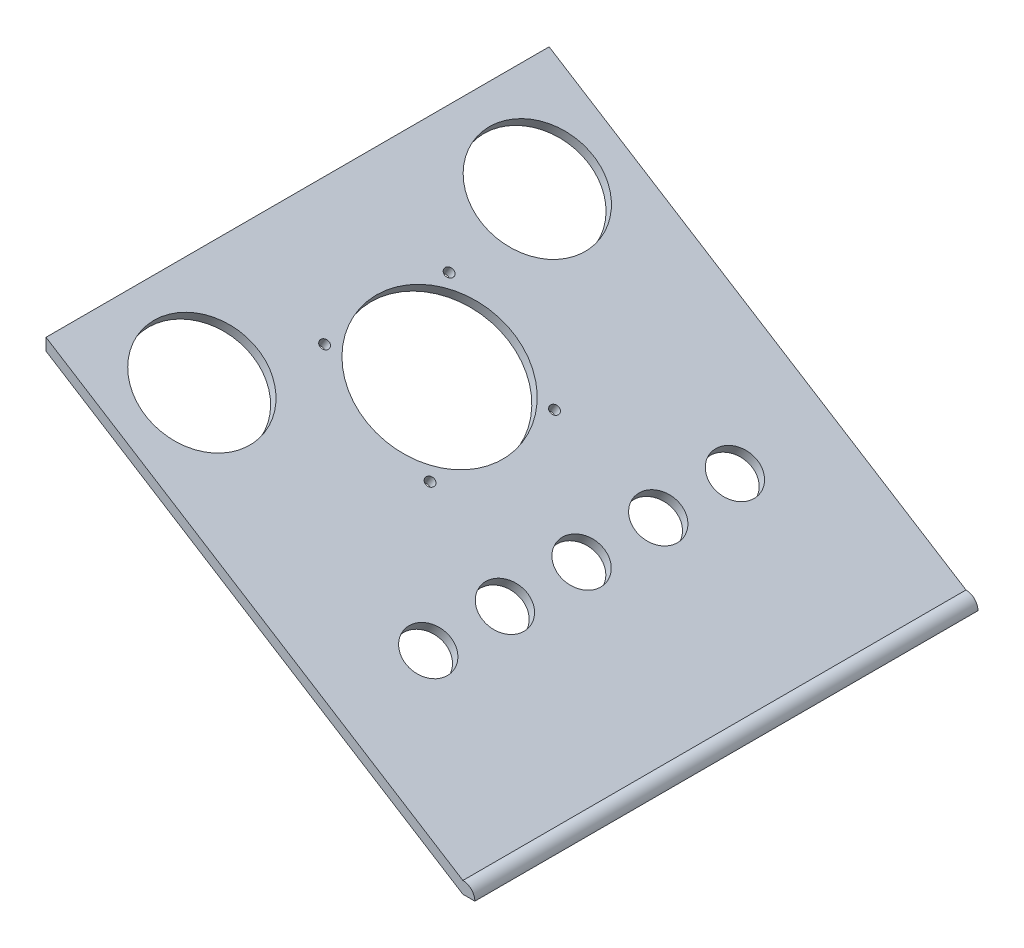
ISO-10303-21;
HEADER;
FILE_DESCRIPTION(('STEP AP214'),'2;1');
FILE_NAME('part.step','',(''),(''),'','','');
FILE_SCHEMA(('AUTOMOTIVE_DESIGN { 1 0 10303 214 1 1 1 1 }'));
ENDSEC;
DATA;
#1=APPLICATION_CONTEXT('core data for automotive mechanical design processes');
#2=APPLICATION_PROTOCOL_DEFINITION('international standard','automotive_design',2000,#1);
#3=PRODUCT_CONTEXT('',#1,'mechanical');
#4=PRODUCT('Part','Part','',(#3));
#5=PRODUCT_RELATED_PRODUCT_CATEGORY('part','',(#4));
#6=PRODUCT_DEFINITION_FORMATION('','',#4);
#7=PRODUCT_DEFINITION_CONTEXT('part definition',#1,'design');
#8=PRODUCT_DEFINITION('design','',#6,#7);
#9=PRODUCT_DEFINITION_SHAPE('','',#8);
#10=(LENGTH_UNIT() NAMED_UNIT(*) SI_UNIT(.MILLI.,.METRE.));
#11=(NAMED_UNIT(*) PLANE_ANGLE_UNIT() SI_UNIT($,.RADIAN.));
#12=(NAMED_UNIT(*) SI_UNIT($,.STERADIAN.) SOLID_ANGLE_UNIT());
#13=UNCERTAINTY_MEASURE_WITH_UNIT(LENGTH_MEASURE(1.E-05),#10,'distance_accuracy_value','');
#14=(GEOMETRIC_REPRESENTATION_CONTEXT(3) GLOBAL_UNCERTAINTY_ASSIGNED_CONTEXT((#13)) GLOBAL_UNIT_ASSIGNED_CONTEXT((#10,
#11,#12)) REPRESENTATION_CONTEXT('',''));
#15=CARTESIAN_POINT('',(0.,0.,0.));
#16=DIRECTION('',(0.,0.,1.));
#17=DIRECTION('',(1.,0.,0.));
#18=AXIS2_PLACEMENT_3D('',#15,#16,#17);
#19=CARTESIAN_POINT('',(0.,3.175,133.35));
#20=DIRECTION('',(0.532029503535746,0.846725815933061,0.));
#21=DIRECTION('',(-0.846725815933061,0.532029503535746,0.));
#22=AXIS2_PLACEMENT_3D('',#19,#20,#21);
#23=PLANE('',#22);
#24=CARTESIAN_POINT('',(75.2739250364491,-44.1224228643278,26.035));
#25=DIRECTION('',(0.532029503535746,0.846725815933061,0.));
#26=DIRECTION('',(-0.846725815933061,0.532029503535746,0.));
#27=AXIS2_PLACEMENT_3D('',#24,#25,#26);
#28=CIRCLE('',#27,6.00000000000001);
#29=CARTESIAN_POINT('',(70.1935701408507,-40.9302458431134,26.035));
#30=VERTEX_POINT('',#29);
#31=EDGE_CURVE('E260',#30,#30,#28,.T.);
#32=ORIENTED_EDGE('',*,*,#31,.F.);
#33=EDGE_LOOP('',(#32));
#34=FACE_BOUND('',#33,.T.);
#35=CARTESIAN_POINT('',(75.2739250364491,-44.1224228643278,86.995));
#36=DIRECTION('',(0.532029503535746,0.846725815933061,0.));
#37=DIRECTION('',(-0.846725815933061,0.532029503535746,0.));
#38=AXIS2_PLACEMENT_3D('',#35,#36,#37);
#39=CIRCLE('',#38,6.00000000000001);
#40=CARTESIAN_POINT('',(70.1935701408507,-40.9302458431134,86.995));
#41=VERTEX_POINT('',#40);
#42=EDGE_CURVE('E261',#41,#41,#39,.T.);
#43=ORIENTED_EDGE('',*,*,#42,.F.);
#44=EDGE_LOOP('',(#43));
#45=FACE_BOUND('',#44,.T.);
#46=CARTESIAN_POINT('',(75.2739250364491,-44.1224228643279,107.315));
#47=DIRECTION('',(0.532029503535746,0.846725815933061,0.));
#48=DIRECTION('',(-0.846725815933061,0.532029503535746,0.));
#49=AXIS2_PLACEMENT_3D('',#46,#47,#48);
#50=CIRCLE('',#49,5.99999999999999);
#51=CARTESIAN_POINT('',(70.1935701408507,-40.9302458431134,107.315));
#52=VERTEX_POINT('',#51);
#53=EDGE_CURVE('E265',#52,#52,#50,.T.);
#54=ORIENTED_EDGE('',*,*,#53,.F.);
#55=EDGE_LOOP('',(#54));
#56=FACE_BOUND('',#55,.T.);
#57=CARTESIAN_POINT('',(75.2739250364491,-44.1224228643278,66.675));
#58=DIRECTION('',(0.532029503535746,0.846725815933061,0.));
#59=DIRECTION('',(-0.846725815933061,0.532029503535746,0.));
#60=AXIS2_PLACEMENT_3D('',#57,#58,#59);
#61=CIRCLE('',#60,5.99998799999999);
#62=CARTESIAN_POINT('',(70.1935803015605,-40.9302522274674,66.675));
#63=VERTEX_POINT('',#62);
#64=EDGE_CURVE('E269',#63,#63,#61,.T.);
#65=ORIENTED_EDGE('',*,*,#64,.F.);
#66=EDGE_LOOP('',(#65));
#67=FACE_BOUND('',#66,.T.);
#68=CARTESIAN_POINT('',(75.2739250364491,-44.1224228643278,46.355));
#69=DIRECTION('',(0.532029503535746,0.846725815933061,0.));
#70=DIRECTION('',(-0.846725815933061,0.532029503535746,0.));
#71=AXIS2_PLACEMENT_3D('',#68,#69,#70);
#72=CIRCLE('',#71,6.00000000000001);
#73=CARTESIAN_POINT('',(70.1935701408507,-40.9302458431134,46.355));
#74=VERTEX_POINT('',#73);
#75=EDGE_CURVE('E231',#74,#74,#72,.T.);
#76=ORIENTED_EDGE('',*,*,#75,.F.);
#77=EDGE_LOOP('',(#76));
#78=FACE_BOUND('',#77,.T.);
#79=CARTESIAN_POINT('',(19.0859481700261,-8.81741518131621,111.125));
#80=DIRECTION('',(0.532029503535746,0.846725815933061,0.));
#81=DIRECTION('',(-0.846725815933061,0.532029503535746,0.));
#82=AXIS2_PLACEMENT_3D('',#79,#80,#81);
#83=CIRCLE('',#82,15.);
#84=CARTESIAN_POINT('',(6.38506093103023,-0.836972628280022,111.125));
#85=VERTEX_POINT('',#84);
#86=EDGE_CURVE('E222',#85,#85,#83,.T.);
#87=ORIENTED_EDGE('',*,*,#86,.F.);
#88=EDGE_LOOP('',(#87));
#89=FACE_BOUND('',#88,.T.);
#90=CARTESIAN_POINT('',(19.0859481700261,-8.8174151813162,22.225));
#91=DIRECTION('',(0.532029503535746,0.846725815933061,0.));
#92=DIRECTION('',(-0.846725815933061,0.532029503535746,0.));
#93=AXIS2_PLACEMENT_3D('',#90,#91,#92);
#94=CIRCLE('',#93,15.);
#95=CARTESIAN_POINT('',(6.38506093103024,-0.83697262828002,22.225));
#96=VERTEX_POINT('',#95);
#97=EDGE_CURVE('E245',#96,#96,#94,.T.);
#98=ORIENTED_EDGE('',*,*,#97,.F.);
#99=EDGE_LOOP('',(#98));
#100=FACE_BOUND('',#99,.T.);
#101=CARTESIAN_POINT('',(51.60793848112,-29.2521982405037,50.175));
#102=DIRECTION('',(0.532029503535746,0.846725815933061,0.));
#103=DIRECTION('',(-0.846725815933061,0.532029503535746,0.));
#104=AXIS2_PLACEMENT_3D('',#101,#102,#103);
#105=CIRCLE('',#104,1.2);
#106=CARTESIAN_POINT('',(50.5918675020004,-28.6137628362608,50.175));
#107=VERTEX_POINT('',#106);
#108=EDGE_CURVE('E160',#107,#107,#105,.T.);
#109=ORIENTED_EDGE('',*,*,#108,.F.);
#110=EDGE_LOOP('',(#109));
#111=FACE_BOUND('',#110,.T.);
#112=CARTESIAN_POINT('',(51.60793848112,-29.2521982405037,83.175));
#113=DIRECTION('',(0.532029503535746,0.846725815933061,0.));
#114=DIRECTION('',(-0.846725815933061,0.532029503535746,0.));
#115=AXIS2_PLACEMENT_3D('',#112,#113,#114);
#116=CIRCLE('',#115,1.2);
#117=CARTESIAN_POINT('',(50.5918675020004,-28.6137628362608,83.175));
#118=VERTEX_POINT('',#117);
#119=EDGE_CURVE('E159',#118,#118,#116,.T.);
#120=ORIENTED_EDGE('',*,*,#119,.F.);
#121=EDGE_LOOP('',(#120));
#122=FACE_BOUND('',#121,.T.);
#123=CARTESIAN_POINT('',(37.6369625182245,-20.4737114321639,66.675));
#124=DIRECTION('',(0.532029503535746,0.846725815933061,0.));
#125=DIRECTION('',(-0.846725815933061,0.532029503535746,0.));
#126=AXIS2_PLACEMENT_3D('',#123,#124,#125);
#127=CIRCLE('',#126,19.75);
#128=CARTESIAN_POINT('',(20.9141276535466,-9.96612873733292,66.675));
#129=VERTEX_POINT('',#128);
#130=EDGE_CURVE('E147',#129,#129,#127,.T.);
#131=ORIENTED_EDGE('',*,*,#130,.F.);
#132=EDGE_LOOP('',(#131));
#133=FACE_BOUND('',#132,.T.);
#134=CARTESIAN_POINT('',(23.665986555329,-11.6952246238241,83.175));
#135=DIRECTION('',(0.532029503535746,0.846725815933061,0.));
#136=DIRECTION('',(-0.846725815933061,0.532029503535746,0.));
#137=AXIS2_PLACEMENT_3D('',#134,#135,#136);
#138=CIRCLE('',#137,1.20000000000003);
#139=CARTESIAN_POINT('',(22.6499155762094,-11.0567892195812,83.175));
#140=VERTEX_POINT('',#139);
#141=EDGE_CURVE('E152',#140,#140,#138,.T.);
#142=ORIENTED_EDGE('',*,*,#141,.F.);
#143=EDGE_LOOP('',(#142));
#144=FACE_BOUND('',#143,.T.);
#145=CARTESIAN_POINT('',(23.665986555329,-11.6952246238241,50.175));
#146=DIRECTION('',(0.532029503535746,0.846725815933061,0.));
#147=DIRECTION('',(-0.846725815933061,0.532029503535746,0.));
#148=AXIS2_PLACEMENT_3D('',#145,#146,#147);
#149=CIRCLE('',#148,1.2);
#150=CARTESIAN_POINT('',(22.6499155762094,-11.0567892195812,50.175));
#151=VERTEX_POINT('',#150);
#152=EDGE_CURVE('E164',#151,#151,#149,.T.);
#153=ORIENTED_EDGE('',*,*,#152,.F.);
#154=EDGE_LOOP('',(#153));
#155=FACE_BOUND('',#154,.T.);
#156=DIRECTION('',(0.846725815933061,-0.532029503535746,0.));
#157=VECTOR('',#156,1.);
#158=CARTESIAN_POINT('',(0.,3.175,0.));
#159=LINE('',#158,#157);
#160=CARTESIAN_POINT('',(0.,3.175,0.));
#161=VERTEX_POINT('',#160);
#162=CARTESIAN_POINT('',(110.49,-66.250000088,0.));
#163=VERTEX_POINT('',#162);
#164=EDGE_CURVE('E175',#161,#163,#159,.T.);
#165=ORIENTED_EDGE('',*,*,#164,.F.);
#166=DIRECTION('',(0.,0.,-1.));
#167=VECTOR('',#166,1.);
#168=CARTESIAN_POINT('',(0.,3.175,133.35));
#169=LINE('',#168,#167);
#170=CARTESIAN_POINT('',(0.,3.175,133.35));
#171=VERTEX_POINT('',#170);
#172=EDGE_CURVE('E103',#171,#161,#169,.T.);
#173=ORIENTED_EDGE('',*,*,#172,.F.);
#174=DIRECTION('',(0.846725815933061,-0.532029503535746,0.));
#175=VECTOR('',#174,1.);
#176=CARTESIAN_POINT('',(0.,3.175,133.35));
#177=LINE('',#176,#175);
#178=CARTESIAN_POINT('',(110.49,-66.250000088,133.35));
#179=VERTEX_POINT('',#178);
#180=EDGE_CURVE('E178',#171,#179,#177,.T.);
#181=ORIENTED_EDGE('',*,*,#180,.T.);
#182=DIRECTION('',(0.,0.,-1.));
#183=VECTOR('',#182,1.);
#184=CARTESIAN_POINT('',(110.49,-66.250000088,133.35));
#185=LINE('',#184,#183);
#186=EDGE_CURVE('E110',#179,#163,#185,.T.);
#187=ORIENTED_EDGE('',*,*,#186,.T.);
#188=EDGE_LOOP('',(#165,#173,#181,#187));
#189=FACE_BOUND('',#188,.T.);
#190=ADVANCED_FACE('F69',(#34,#45,#56,#67,#78,#89,#100,#111,#122,#133,#144,#155,#189),#23,.T.);
#191=CARTESIAN_POINT('',(0.,0.,133.35));
#192=DIRECTION('',(-1.,0.,0.));
#193=DIRECTION('',(0.,0.,1.));
#194=AXIS2_PLACEMENT_3D('',#191,#192,#193);
#195=PLANE('',#194);
#196=DIRECTION('',(0.,1.,0.));
#197=VECTOR('',#196,1.);
#198=CARTESIAN_POINT('',(0.,0.,0.));
#199=LINE('',#198,#197);
#200=CARTESIAN_POINT('',(0.,0.,0.));
#201=VERTEX_POINT('',#200);
#202=EDGE_CURVE('E185',#201,#161,#199,.T.);
#203=ORIENTED_EDGE('',*,*,#202,.F.);
#204=DIRECTION('',(0.,0.,-1.));
#205=VECTOR('',#204,1.);
#206=CARTESIAN_POINT('',(0.,0.,133.35));
#207=LINE('',#206,#205);
#208=CARTESIAN_POINT('',(0.,0.,133.35));
#209=VERTEX_POINT('',#208);
#210=EDGE_CURVE('E195',#209,#201,#207,.T.);
#211=ORIENTED_EDGE('',*,*,#210,.F.);
#212=DIRECTION('',(0.,1.,0.));
#213=VECTOR('',#212,1.);
#214=CARTESIAN_POINT('',(0.,0.,133.35));
#215=LINE('',#214,#213);
#216=EDGE_CURVE('E174',#209,#171,#215,.T.);
#217=ORIENTED_EDGE('',*,*,#216,.T.);
#218=ORIENTED_EDGE('',*,*,#172,.T.);
#219=EDGE_LOOP('',(#203,#211,#217,#218));
#220=FACE_BOUND('',#219,.T.);
#221=ADVANCED_FACE('F281',(#220),#195,.T.);
#222=CARTESIAN_POINT('',(110.49,-69.425000088,133.35));
#223=DIRECTION('',(-0.532029503535746,-0.846725815933061,0.));
#224=DIRECTION('',(0.846725815933061,-0.532029503535746,0.));
#225=AXIS2_PLACEMENT_3D('',#222,#223,#224);
#226=PLANE('',#225);
#227=CARTESIAN_POINT('',(73.8436411447945,-46.3987219927197,26.035));
#228=DIRECTION('',(-0.532029503535746,-0.846725815933061,0.));
#229=DIRECTION('',(0.846725815933061,-0.532029503535746,0.));
#230=AXIS2_PLACEMENT_3D('',#227,#228,#229);
#231=CIRCLE('',#230,6.00000000000001);
#232=CARTESIAN_POINT('',(78.9239960403928,-49.5908990139341,26.035));
#233=VERTEX_POINT('',#232);
#234=EDGE_CURVE('E73',#233,#233,#231,.T.);
#235=ORIENTED_EDGE('',*,*,#234,.F.);
#236=EDGE_LOOP('',(#235));
#237=FACE_BOUND('',#236,.T.);
#238=CARTESIAN_POINT('',(73.8436411447945,-46.3987219927197,86.995));
#239=DIRECTION('',(-0.532029503535746,-0.846725815933061,0.));
#240=DIRECTION('',(0.846725815933061,-0.532029503535746,0.));
#241=AXIS2_PLACEMENT_3D('',#238,#239,#240);
#242=CIRCLE('',#241,6.00000000000001);
#243=CARTESIAN_POINT('',(78.9239960403928,-49.5908990139341,86.995));
#244=VERTEX_POINT('',#243);
#245=EDGE_CURVE('E238',#244,#244,#242,.T.);
#246=ORIENTED_EDGE('',*,*,#245,.F.);
#247=EDGE_LOOP('',(#246));
#248=FACE_BOUND('',#247,.T.);
#249=CARTESIAN_POINT('',(73.8436411447945,-46.3987219927197,107.315));
#250=DIRECTION('',(-0.532029503535746,-0.846725815933061,0.));
#251=DIRECTION('',(0.846725815933061,-0.532029503535746,0.));
#252=AXIS2_PLACEMENT_3D('',#249,#250,#251);
#253=CIRCLE('',#252,5.99999999999999);
#254=CARTESIAN_POINT('',(78.9239960403928,-49.5908990139341,107.315));
#255=VERTEX_POINT('',#254);
#256=EDGE_CURVE('E235',#255,#255,#253,.T.);
#257=ORIENTED_EDGE('',*,*,#256,.F.);
#258=EDGE_LOOP('',(#257));
#259=FACE_BOUND('',#258,.T.);
#260=CARTESIAN_POINT('',(73.8436411447945,-46.3987219927197,66.675));
#261=DIRECTION('',(-0.532029503535746,-0.846725815933061,0.));
#262=DIRECTION('',(0.846725815933061,-0.532029503535746,0.));
#263=AXIS2_PLACEMENT_3D('',#260,#261,#262);
#264=CIRCLE('',#263,5.99998799999999);
#265=CARTESIAN_POINT('',(78.923985879683,-49.5908926295801,66.675));
#266=VERTEX_POINT('',#265);
#267=EDGE_CURVE('E230',#266,#266,#264,.T.);
#268=ORIENTED_EDGE('',*,*,#267,.F.);
#269=EDGE_LOOP('',(#268));
#270=FACE_BOUND('',#269,.T.);
#271=CARTESIAN_POINT('',(73.8436411447945,-46.3987219927197,46.355));
#272=DIRECTION('',(-0.532029503535746,-0.846725815933061,0.));
#273=DIRECTION('',(0.846725815933061,-0.532029503535746,0.));
#274=AXIS2_PLACEMENT_3D('',#271,#272,#273);
#275=CIRCLE('',#274,6.00000000000001);
#276=CARTESIAN_POINT('',(78.9239960403928,-49.5908990139341,46.355));
#277=VERTEX_POINT('',#276);
#278=EDGE_CURVE('E226',#277,#277,#275,.T.);
#279=ORIENTED_EDGE('',*,*,#278,.F.);
#280=EDGE_LOOP('',(#279));
#281=FACE_BOUND('',#280,.T.);
#282=CARTESIAN_POINT('',(17.6556642783715,-11.093714309708,111.125));
#283=DIRECTION('',(-0.532029503535746,-0.846725815933061,0.));
#284=DIRECTION('',(0.846725815933061,-0.532029503535746,0.));
#285=AXIS2_PLACEMENT_3D('',#282,#283,#284);
#286=CIRCLE('',#285,15.);
#287=CARTESIAN_POINT('',(30.3565515173674,-19.0741568627442,111.125));
#288=VERTEX_POINT('',#287);
#289=EDGE_CURVE('E141',#288,#288,#286,.T.);
#290=ORIENTED_EDGE('',*,*,#289,.F.);
#291=EDGE_LOOP('',(#290));
#292=FACE_BOUND('',#291,.T.);
#293=CARTESIAN_POINT('',(17.6556642783715,-11.093714309708,22.225));
#294=DIRECTION('',(-0.532029503535746,-0.846725815933061,0.));
#295=DIRECTION('',(0.846725815933061,-0.532029503535746,0.));
#296=AXIS2_PLACEMENT_3D('',#293,#294,#295);
#297=CIRCLE('',#296,15.);
#298=CARTESIAN_POINT('',(30.3565515173674,-19.0741568627442,22.225));
#299=VERTEX_POINT('',#298);
#300=EDGE_CURVE('E218',#299,#299,#297,.T.);
#301=ORIENTED_EDGE('',*,*,#300,.F.);
#302=EDGE_LOOP('',(#301));
#303=FACE_BOUND('',#302,.T.);
#304=CARTESIAN_POINT('',(50.1776545894654,-31.5284973688956,50.175));
#305=DIRECTION('',(-0.532029503535746,-0.846725815933061,0.));
#306=DIRECTION('',(0.846725815933061,-0.532029503535746,0.));
#307=AXIS2_PLACEMENT_3D('',#304,#305,#306);
#308=CIRCLE('',#307,1.2);
#309=CARTESIAN_POINT('',(51.1937255685851,-32.1669327731385,50.175));
#310=VERTEX_POINT('',#309);
#311=EDGE_CURVE('E186',#310,#310,#308,.T.);
#312=ORIENTED_EDGE('',*,*,#311,.F.);
#313=EDGE_LOOP('',(#312));
#314=FACE_BOUND('',#313,.T.);
#315=CARTESIAN_POINT('',(50.1776545894654,-31.5284973688956,83.175));
#316=DIRECTION('',(-0.532029503535746,-0.846725815933061,0.));
#317=DIRECTION('',(0.846725815933061,-0.532029503535746,0.));
#318=AXIS2_PLACEMENT_3D('',#315,#316,#317);
#319=CIRCLE('',#318,1.2);
#320=CARTESIAN_POINT('',(51.1937255685851,-32.1669327731385,83.175));
#321=VERTEX_POINT('',#320);
#322=EDGE_CURVE('E211',#321,#321,#319,.T.);
#323=ORIENTED_EDGE('',*,*,#322,.F.);
#324=EDGE_LOOP('',(#323));
#325=FACE_BOUND('',#324,.T.);
#326=CARTESIAN_POINT('',(36.2066786265699,-22.7500105605557,66.675));
#327=DIRECTION('',(-0.532029503535746,-0.846725815933061,0.));
#328=DIRECTION('',(0.846725815933061,-0.532029503535746,0.));
#329=AXIS2_PLACEMENT_3D('',#326,#327,#328);
#330=CIRCLE('',#329,19.75);
#331=CARTESIAN_POINT('',(52.9295134912479,-33.2575932553867,66.675));
#332=VERTEX_POINT('',#331);
#333=EDGE_CURVE('E207',#332,#332,#330,.T.);
#334=ORIENTED_EDGE('',*,*,#333,.F.);
#335=EDGE_LOOP('',(#334));
#336=FACE_BOUND('',#335,.T.);
#337=CARTESIAN_POINT('',(22.2357026636744,-13.9715237522159,83.175));
#338=DIRECTION('',(-0.532029503535746,-0.846725815933061,0.));
#339=DIRECTION('',(0.846725815933061,-0.532029503535746,0.));
#340=AXIS2_PLACEMENT_3D('',#337,#338,#339);
#341=CIRCLE('',#340,1.20000000000003);
#342=CARTESIAN_POINT('',(23.2517736427941,-14.6099591564588,83.175));
#343=VERTEX_POINT('',#342);
#344=EDGE_CURVE('E203',#343,#343,#341,.T.);
#345=ORIENTED_EDGE('',*,*,#344,.F.);
#346=EDGE_LOOP('',(#345));
#347=FACE_BOUND('',#346,.T.);
#348=CARTESIAN_POINT('',(22.2357026636744,-13.9715237522159,50.175));
#349=DIRECTION('',(-0.532029503535746,-0.846725815933061,0.));
#350=DIRECTION('',(0.846725815933061,-0.532029503535746,0.));
#351=AXIS2_PLACEMENT_3D('',#348,#349,#350);
#352=CIRCLE('',#351,1.2);
#353=CARTESIAN_POINT('',(23.2517736427941,-14.6099591564588,50.175));
#354=VERTEX_POINT('',#353);
#355=EDGE_CURVE('E171',#354,#354,#352,.T.);
#356=ORIENTED_EDGE('',*,*,#355,.F.);
#357=EDGE_LOOP('',(#356));
#358=FACE_BOUND('',#357,.T.);
#359=DIRECTION('',(-0.846725815933061,0.532029503535746,0.));
#360=VECTOR('',#359,1.);
#361=CARTESIAN_POINT('',(110.49,-69.425000088,0.));
#362=LINE('',#361,#360);
#363=CARTESIAN_POINT('',(110.489999999999,-69.425000087999,0.));
#364=VERTEX_POINT('',#363);
#365=EDGE_CURVE('E181',#364,#201,#362,.T.);
#366=ORIENTED_EDGE('',*,*,#365,.F.);
#367=DIRECTION('',(0.,0.,-1.));
#368=VECTOR('',#367,1.);
#369=CARTESIAN_POINT('',(110.49,-69.425000088,133.35));
#370=LINE('',#369,#368);
#371=CARTESIAN_POINT('',(110.49,-69.425000088,133.35));
#372=VERTEX_POINT('',#371);
#373=EDGE_CURVE('E118',#372,#364,#370,.T.);
#374=ORIENTED_EDGE('',*,*,#373,.F.);
#375=DIRECTION('',(-0.846725815933061,0.532029503535746,0.));
#376=VECTOR('',#375,1.);
#377=CARTESIAN_POINT('',(110.49,-69.425000088,133.35));
#378=LINE('',#377,#376);
#379=EDGE_CURVE('E145',#372,#209,#378,.T.);
#380=ORIENTED_EDGE('',*,*,#379,.T.);
#381=ORIENTED_EDGE('',*,*,#210,.T.);
#382=EDGE_LOOP('',(#366,#374,#380,#381));
#383=FACE_BOUND('',#382,.T.);
#384=ADVANCED_FACE('F302',(#237,#248,#259,#270,#281,#292,#303,#314,#325,#336,#347,#358,#383),
#226,.T.);
#385=CARTESIAN_POINT('',(0.,0.,133.35));
#386=DIRECTION('',(0.,0.,-1.));
#387=DIRECTION('',(-1.,0.,0.));
#388=AXIS2_PLACEMENT_3D('',#385,#386,#387);
#389=PLANE('',#388);
#390=DIRECTION('',(-1.,0.,0.));
#391=VECTOR('',#390,1.);
#392=CARTESIAN_POINT('',(113.664999999999,-69.425000087999,133.35));
#393=LINE('',#392,#391);
#394=CARTESIAN_POINT('',(113.664999999999,-69.425000087999,133.35));
#395=VERTEX_POINT('',#394);
#396=EDGE_CURVE('E137',#395,#372,#393,.T.);
#397=ORIENTED_EDGE('',*,*,#396,.F.);
#398=CARTESIAN_POINT('',(110.489999999999,-69.425000087999,133.35));
#399=DIRECTION('',(0.,0.,-1.));
#400=DIRECTION('',(-1.,0.,0.));
#401=AXIS2_PLACEMENT_3D('',#398,#399,#400);
#402=CIRCLE('',#401,3.175);
#403=EDGE_CURVE('E80',#395,#179,#402,.F.);
#404=ORIENTED_EDGE('',*,*,#403,.T.);
#405=ORIENTED_EDGE('',*,*,#180,.F.);
#406=ORIENTED_EDGE('',*,*,#216,.F.);
#407=ORIENTED_EDGE('',*,*,#379,.F.);
#408=EDGE_LOOP('',(#397,#404,#405,#406,#407));
#409=FACE_BOUND('',#408,.T.);
#410=ADVANCED_FACE('F143',(#409),#389,.F.);
#411=CARTESIAN_POINT('',(0.,0.,0.));
#412=DIRECTION('',(0.,0.,-1.));
#413=DIRECTION('',(-1.,0.,0.));
#414=AXIS2_PLACEMENT_3D('',#411,#412,#413);
#415=PLANE('',#414);
#416=ORIENTED_EDGE('',*,*,#164,.T.);
#417=CARTESIAN_POINT('',(110.489999999999,-69.425000087999,0.));
#418=DIRECTION('',(0.,0.,-1.));
#419=DIRECTION('',(-1.,0.,0.));
#420=AXIS2_PLACEMENT_3D('',#417,#418,#419);
#421=CIRCLE('',#420,3.175);
#422=CARTESIAN_POINT('',(113.664999999999,-69.425000087999,0.));
#423=VERTEX_POINT('',#422);
#424=EDGE_CURVE('E12',#163,#423,#421,.T.);
#425=ORIENTED_EDGE('',*,*,#424,.T.);
#426=DIRECTION('',(-1.,0.,0.));
#427=VECTOR('',#426,1.);
#428=CARTESIAN_POINT('',(113.664999999999,-69.425000087999,0.));
#429=LINE('',#428,#427);
#430=EDGE_CURVE('E139',#423,#364,#429,.T.);
#431=ORIENTED_EDGE('',*,*,#430,.T.);
#432=ORIENTED_EDGE('',*,*,#365,.T.);
#433=ORIENTED_EDGE('',*,*,#202,.T.);
#434=EDGE_LOOP('',(#416,#425,#431,#432,#433));
#435=FACE_BOUND('',#434,.T.);
#436=ADVANCED_FACE('F301',(#435),#415,.T.);
#437=CARTESIAN_POINT('',(-9.03908766828967,-63.7454031817963,50.175));
#438=DIRECTION('',(0.532029503535746,0.846725815933061,0.));
#439=DIRECTION('',(-0.846725815933061,0.532029503535746,0.));
#440=AXIS2_PLACEMENT_3D('',#437,#438,#439);
#441=CYLINDRICAL_SURFACE('',#440,1.2);
#442=ORIENTED_EDGE('',*,*,#355,.T.);
#443=EDGE_LOOP('',(#442));
#444=FACE_BOUND('',#443,.T.);
#445=ORIENTED_EDGE('',*,*,#152,.T.);
#446=EDGE_LOOP('',(#445));
#447=FACE_BOUND('',#446,.T.);
#448=ADVANCED_FACE('F315',(#444,#447),#441,.F.);
#449=CARTESIAN_POINT('',(-9.03908766828967,-63.7454031817963,83.175));
#450=DIRECTION('',(0.532029503535746,0.846725815933061,0.));
#451=DIRECTION('',(-0.846725815933061,0.532029503535746,0.));
#452=AXIS2_PLACEMENT_3D('',#449,#450,#451);
#453=CYLINDRICAL_SURFACE('',#452,1.20000000000003);
#454=ORIENTED_EDGE('',*,*,#344,.T.);
#455=EDGE_LOOP('',(#454));
#456=FACE_BOUND('',#455,.T.);
#457=ORIENTED_EDGE('',*,*,#141,.T.);
#458=EDGE_LOOP('',(#457));
#459=FACE_BOUND('',#458,.T.);
#460=ADVANCED_FACE('F319',(#456,#459),#453,.F.);
#461=CARTESIAN_POINT('',(4.93188829460583,-72.5238899901361,66.675));
#462=DIRECTION('',(0.532029503535746,0.846725815933061,0.));
#463=DIRECTION('',(-0.846725815933061,0.532029503535746,0.));
#464=AXIS2_PLACEMENT_3D('',#461,#462,#463);
#465=CYLINDRICAL_SURFACE('',#464,19.75);
#466=ORIENTED_EDGE('',*,*,#333,.T.);
#467=EDGE_LOOP('',(#466));
#468=FACE_BOUND('',#467,.T.);
#469=ORIENTED_EDGE('',*,*,#130,.T.);
#470=EDGE_LOOP('',(#469));
#471=FACE_BOUND('',#470,.T.);
#472=ADVANCED_FACE('F325',(#468,#471),#465,.F.);
#473=CARTESIAN_POINT('',(18.9028642575013,-81.3023767984759,83.175));
#474=DIRECTION('',(0.532029503535746,0.846725815933061,0.));
#475=DIRECTION('',(-0.846725815933061,0.532029503535746,0.));
#476=AXIS2_PLACEMENT_3D('',#473,#474,#475);
#477=CYLINDRICAL_SURFACE('',#476,1.2);
#478=ORIENTED_EDGE('',*,*,#322,.T.);
#479=EDGE_LOOP('',(#478));
#480=FACE_BOUND('',#479,.T.);
#481=ORIENTED_EDGE('',*,*,#119,.T.);
#482=EDGE_LOOP('',(#481));
#483=FACE_BOUND('',#482,.T.);
#484=ADVANCED_FACE('F321',(#480,#483),#477,.F.);
#485=CARTESIAN_POINT('',(18.9028642575013,-81.3023767984759,50.175));
#486=DIRECTION('',(0.532029503535746,0.846725815933061,0.));
#487=DIRECTION('',(-0.846725815933061,0.532029503535746,0.));
#488=AXIS2_PLACEMENT_3D('',#485,#486,#487);
#489=CYLINDRICAL_SURFACE('',#488,1.2);
#490=ORIENTED_EDGE('',*,*,#311,.T.);
#491=EDGE_LOOP('',(#490));
#492=FACE_BOUND('',#491,.T.);
#493=ORIENTED_EDGE('',*,*,#108,.T.);
#494=EDGE_LOOP('',(#493));
#495=FACE_BOUND('',#494,.T.);
#496=ADVANCED_FACE('F324',(#492,#495),#489,.F.);
#497=CARTESIAN_POINT('',(113.664999999999,-69.425000087999,133.35));
#498=DIRECTION('',(0.,1.,0.));
#499=DIRECTION('',(-1.,0.,0.));
#500=AXIS2_PLACEMENT_3D('',#497,#498,#499);
#501=PLANE('',#500);
#502=ORIENTED_EDGE('',*,*,#373,.T.);
#503=ORIENTED_EDGE('',*,*,#430,.F.);
#504=DIRECTION('',(0.,0.,-1.));
#505=VECTOR('',#504,1.);
#506=CARTESIAN_POINT('',(113.664999999999,-69.425000087999,133.35));
#507=LINE('',#506,#505);
#508=EDGE_CURVE('E130',#395,#423,#507,.T.);
#509=ORIENTED_EDGE('',*,*,#508,.F.);
#510=ORIENTED_EDGE('',*,*,#396,.T.);
#511=EDGE_LOOP('',(#502,#503,#509,#510));
#512=FACE_BOUND('',#511,.T.);
#513=ADVANCED_FACE('F136',(#512),#501,.F.);
#514=CARTESIAN_POINT('',(110.489999999999,-69.425000087999,0.));
#515=DIRECTION('',(0.,0.,-1.));
#516=DIRECTION('',(-1.,0.,0.));
#517=AXIS2_PLACEMENT_3D('',#514,#515,#516);
#518=CYLINDRICAL_SURFACE('',#517,3.175);
#519=ORIENTED_EDGE('',*,*,#424,.F.);
#520=ORIENTED_EDGE('',*,*,#186,.F.);
#521=ORIENTED_EDGE('',*,*,#403,.F.);
#522=ORIENTED_EDGE('',*,*,#508,.T.);
#523=EDGE_LOOP('',(#519,#520,#521,#522));
#524=FACE_BOUND('',#523,.T.);
#525=ADVANCED_FACE('F71',(#524),#518,.T.);
#526=CARTESIAN_POINT('',(-13.6191260535926,-60.8675937392884,22.225));
#527=DIRECTION('',(0.532029503535747,0.846725815933061,0.));
#528=DIRECTION('',(-0.846725815933061,0.532029503535746,0.));
#529=AXIS2_PLACEMENT_3D('',#526,#527,#528);
#530=CYLINDRICAL_SURFACE('',#529,15.);
#531=ORIENTED_EDGE('',*,*,#300,.T.);
#532=EDGE_LOOP('',(#531));
#533=FACE_BOUND('',#532,.T.);
#534=ORIENTED_EDGE('',*,*,#97,.T.);
#535=EDGE_LOOP('',(#534));
#536=FACE_BOUND('',#535,.T.);
#537=ADVANCED_FACE('F338',(#533,#536),#530,.F.);
#538=CARTESIAN_POINT('',(-13.6191260535926,-60.8675937392884,111.125));
#539=DIRECTION('',(0.532029503535747,0.846725815933061,0.));
#540=DIRECTION('',(-0.846725815933061,0.532029503535746,0.));
#541=AXIS2_PLACEMENT_3D('',#538,#539,#540);
#542=CYLINDRICAL_SURFACE('',#541,15.);
#543=ORIENTED_EDGE('',*,*,#289,.T.);
#544=EDGE_LOOP('',(#543));
#545=FACE_BOUND('',#544,.T.);
#546=ORIENTED_EDGE('',*,*,#86,.T.);
#547=EDGE_LOOP('',(#546));
#548=FACE_BOUND('',#547,.T.);
#549=ADVANCED_FACE('F341',(#545,#548),#542,.F.);
#550=CARTESIAN_POINT('',(42.5688508128303,-96.1726014223,46.355));
#551=DIRECTION('',(0.532029503535746,0.846725815933061,0.));
#552=DIRECTION('',(-0.846725815933061,0.532029503535746,0.));
#553=AXIS2_PLACEMENT_3D('',#550,#551,#552);
#554=CYLINDRICAL_SURFACE('',#553,6.00000000000001);
#555=ORIENTED_EDGE('',*,*,#278,.T.);
#556=EDGE_LOOP('',(#555));
#557=FACE_BOUND('',#556,.T.);
#558=ORIENTED_EDGE('',*,*,#75,.T.);
#559=EDGE_LOOP('',(#558));
#560=FACE_BOUND('',#559,.T.);
#561=ADVANCED_FACE('F345',(#557,#560),#554,.F.);
#562=CARTESIAN_POINT('',(42.5688508128303,-96.1726014223,66.675));
#563=DIRECTION('',(0.532029503535746,0.846725815933061,0.));
#564=DIRECTION('',(-0.846725815933061,0.532029503535746,0.));
#565=AXIS2_PLACEMENT_3D('',#562,#563,#564);
#566=CYLINDRICAL_SURFACE('',#565,5.99998799999999);
#567=ORIENTED_EDGE('',*,*,#267,.T.);
#568=EDGE_LOOP('',(#567));
#569=FACE_BOUND('',#568,.T.);
#570=ORIENTED_EDGE('',*,*,#64,.T.);
#571=EDGE_LOOP('',(#570));
#572=FACE_BOUND('',#571,.T.);
#573=ADVANCED_FACE('F348',(#569,#572),#566,.F.);
#574=CARTESIAN_POINT('',(42.5688508128303,-96.1726014223,107.315));
#575=DIRECTION('',(0.532029503535746,0.846725815933061,0.));
#576=DIRECTION('',(-0.846725815933061,0.532029503535746,0.));
#577=AXIS2_PLACEMENT_3D('',#574,#575,#576);
#578=CYLINDRICAL_SURFACE('',#577,5.99999999999999);
#579=ORIENTED_EDGE('',*,*,#256,.T.);
#580=EDGE_LOOP('',(#579));
#581=FACE_BOUND('',#580,.T.);
#582=ORIENTED_EDGE('',*,*,#53,.T.);
#583=EDGE_LOOP('',(#582));
#584=FACE_BOUND('',#583,.T.);
#585=ADVANCED_FACE('F277',(#581,#584),#578,.F.);
#586=CARTESIAN_POINT('',(42.5688508128303,-96.1726014223,86.995));
#587=DIRECTION('',(0.532029503535746,0.846725815933061,0.));
#588=DIRECTION('',(-0.846725815933061,0.532029503535746,0.));
#589=AXIS2_PLACEMENT_3D('',#586,#587,#588);
#590=CYLINDRICAL_SURFACE('',#589,6.00000000000001);
#591=ORIENTED_EDGE('',*,*,#245,.T.);
#592=EDGE_LOOP('',(#591));
#593=FACE_BOUND('',#592,.T.);
#594=ORIENTED_EDGE('',*,*,#42,.T.);
#595=EDGE_LOOP('',(#594));
#596=FACE_BOUND('',#595,.T.);
#597=ADVANCED_FACE('F350',(#593,#596),#590,.F.);
#598=CARTESIAN_POINT('',(42.5688508128303,-96.1726014223,26.035));
#599=DIRECTION('',(0.532029503535746,0.846725815933061,0.));
#600=DIRECTION('',(-0.846725815933061,0.532029503535746,0.));
#601=AXIS2_PLACEMENT_3D('',#598,#599,#600);
#602=CYLINDRICAL_SURFACE('',#601,6.00000000000001);
#603=ORIENTED_EDGE('',*,*,#234,.T.);
#604=EDGE_LOOP('',(#603));
#605=FACE_BOUND('',#604,.T.);
#606=ORIENTED_EDGE('',*,*,#31,.T.);
#607=EDGE_LOOP('',(#606));
#608=FACE_BOUND('',#607,.T.);
#609=ADVANCED_FACE('F353',(#605,#608),#602,.F.);
#610=CLOSED_SHELL('',(#190,#221,#384,#410,#436,#448,#460,#472,#484,#496,#513,#525,#537,#549,
#561,#573,#585,#597,#609));
#611=MANIFOLD_SOLID_BREP('B2',#610);
#612=ADVANCED_BREP_SHAPE_REPRESENTATION('',(#18,#611),#14);
#613=SHAPE_DEFINITION_REPRESENTATION(#9,#612);
ENDSEC;
END-ISO-10303-21;
